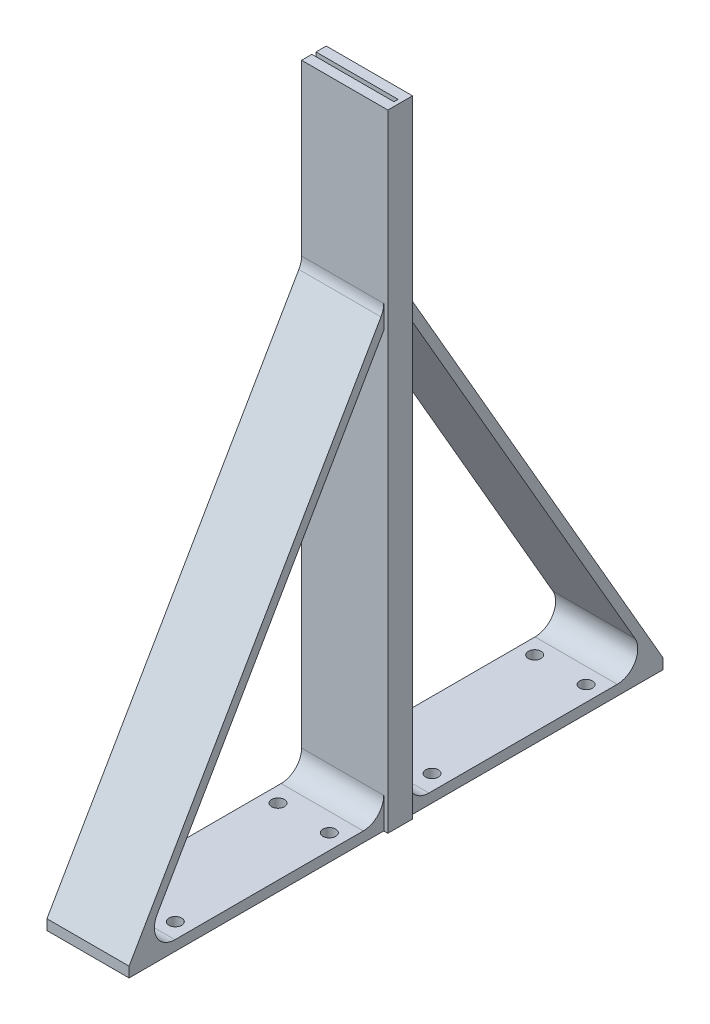
ISO-10303-21;
HEADER;
FILE_DESCRIPTION(('STEP AP214'),'2;1');
FILE_NAME('part.step','',(''),(''),'','','');
FILE_SCHEMA(('AUTOMOTIVE_DESIGN { 1 0 10303 214 1 1 1 1 }'));
ENDSEC;
DATA;
#1=APPLICATION_CONTEXT('core data for automotive mechanical design processes');
#2=APPLICATION_PROTOCOL_DEFINITION('international standard','automotive_design',2000,#1);
#3=PRODUCT_CONTEXT('',#1,'mechanical');
#4=PRODUCT('Part','Part','',(#3));
#5=PRODUCT_RELATED_PRODUCT_CATEGORY('part','',(#4));
#6=PRODUCT_DEFINITION_FORMATION('','',#4);
#7=PRODUCT_DEFINITION_CONTEXT('part definition',#1,'design');
#8=PRODUCT_DEFINITION('design','',#6,#7);
#9=PRODUCT_DEFINITION_SHAPE('','',#8);
#10=(LENGTH_UNIT() NAMED_UNIT(*) SI_UNIT(.MILLI.,.METRE.));
#11=(NAMED_UNIT(*) PLANE_ANGLE_UNIT() SI_UNIT($,.RADIAN.));
#12=(NAMED_UNIT(*) SI_UNIT($,.STERADIAN.) SOLID_ANGLE_UNIT());
#13=UNCERTAINTY_MEASURE_WITH_UNIT(LENGTH_MEASURE(1.E-05),#10,'distance_accuracy_value','');
#14=(GEOMETRIC_REPRESENTATION_CONTEXT(3) GLOBAL_UNCERTAINTY_ASSIGNED_CONTEXT((#13)) GLOBAL_UNIT_ASSIGNED_CONTEXT((#10,
#11,#12)) REPRESENTATION_CONTEXT('',''));
#15=CARTESIAN_POINT('',(0.,0.,0.));
#16=DIRECTION('',(0.,0.,1.));
#17=DIRECTION('',(1.,0.,0.));
#18=AXIS2_PLACEMENT_3D('',#15,#16,#17);
#19=CARTESIAN_POINT('',(20.,5.,130.));
#20=DIRECTION('',(-1.,0.,0.));
#21=DIRECTION('',(0.,0.,1.));
#22=AXIS2_PLACEMENT_3D('',#19,#20,#21);
#23=PLANE('',#22);
#24=DIRECTION('',(0.,-1.,0.));
#25=VECTOR('',#24,1.);
#26=CARTESIAN_POINT('',(20.,305.,6.00000000000001));
#27=LINE('',#26,#25);
#28=CARTESIAN_POINT('',(20.,222.45379206285,5.99999999999999));
#29=VERTEX_POINT('',#28);
#30=CARTESIAN_POINT('',(20.,211.114046100694,5.99999999999999));
#31=VERTEX_POINT('',#30);
#32=EDGE_CURVE('E395',#29,#31,#27,.T.);
#33=ORIENTED_EDGE('',*,*,#32,.F.);
#34=CARTESIAN_POINT('',(20.,222.45379206285,16.));
#35=DIRECTION('',(-1.,0.,0.));
#36=DIRECTION('',(0.,0.,1.));
#37=AXIS2_PLACEMENT_3D('',#34,#35,#36);
#38=CIRCLE('',#37,10.);
#39=CARTESIAN_POINT('',(20.,217.45379206285,7.33974596215564));
#40=VERTEX_POINT('',#39);
#41=EDGE_CURVE('E423',#29,#40,#38,.T.);
#42=ORIENTED_EDGE('',*,*,#41,.T.);
#43=DIRECTION('',(0.,-0.866025403784436,0.500000000000004));
#44=VECTOR('',#43,1.);
#45=CARTESIAN_POINT('',(20.,5.,130.));
#46=LINE('',#45,#44);
#47=CARTESIAN_POINT('',(20.,5.,130.));
#48=VERTEX_POINT('',#47);
#49=EDGE_CURVE('E260',#40,#48,#46,.T.);
#50=ORIENTED_EDGE('',*,*,#49,.T.);
#51=DIRECTION('',(0.,-1.,0.));
#52=VECTOR('',#51,1.);
#53=CARTESIAN_POINT('',(20.,5.,130.));
#54=LINE('',#53,#52);
#55=CARTESIAN_POINT('',(20.,0.,130.));
#56=VERTEX_POINT('',#55);
#57=EDGE_CURVE('E371',#48,#56,#54,.T.);
#58=ORIENTED_EDGE('',*,*,#57,.T.);
#59=DIRECTION('',(0.,0.,-1.));
#60=VECTOR('',#59,1.);
#61=CARTESIAN_POINT('',(20.,0.,130.));
#62=LINE('',#61,#60);
#63=CARTESIAN_POINT('',(20.,0.,5.99999999999997));
#64=VERTEX_POINT('',#63);
#65=EDGE_CURVE('E372',#56,#64,#62,.T.);
#66=ORIENTED_EDGE('',*,*,#65,.T.);
#67=CARTESIAN_POINT('',(20.,15.,5.99999999999997));
#68=VERTEX_POINT('',#67);
#69=EDGE_CURVE('E238',#68,#64,#27,.T.);
#70=ORIENTED_EDGE('',*,*,#69,.F.);
#71=CARTESIAN_POINT('',(20.,15.,16.));
#72=DIRECTION('',(-1.,0.,0.));
#73=DIRECTION('',(0.,0.,1.));
#74=AXIS2_PLACEMENT_3D('',#71,#72,#73);
#75=CIRCLE('',#74,10.);
#76=CARTESIAN_POINT('',(20.,5.,16.));
#77=VERTEX_POINT('',#76);
#78=EDGE_CURVE('E430',#68,#77,#75,.T.);
#79=ORIENTED_EDGE('',*,*,#78,.T.);
#80=DIRECTION('',(0.,0.,-1.));
#81=VECTOR('',#80,1.);
#82=CARTESIAN_POINT('',(20.,5.,130.));
#83=LINE('',#82,#81);
#84=CARTESIAN_POINT('',(20.,5.,107.679491924311));
#85=VERTEX_POINT('',#84);
#86=EDGE_CURVE('E359',#85,#77,#83,.T.);
#87=ORIENTED_EDGE('',*,*,#86,.F.);
#88=CARTESIAN_POINT('',(20.,15.,107.679491924311));
#89=DIRECTION('',(-1.,0.,0.));
#90=DIRECTION('',(0.,0.,1.));
#91=AXIS2_PLACEMENT_3D('',#88,#89,#90);
#92=CIRCLE('',#91,10.);
#93=CARTESIAN_POINT('',(20.,20.,116.339745962156));
#94=VERTEX_POINT('',#93);
#95=EDGE_CURVE('E441',#85,#94,#92,.T.);
#96=ORIENTED_EDGE('',*,*,#95,.T.);
#97=DIRECTION('',(0.,0.866025403784436,-0.500000000000004));
#98=VECTOR('',#97,1.);
#99=CARTESIAN_POINT('',(20.,211.114046100694,6.));
#100=LINE('',#99,#98);
#101=EDGE_CURVE('E262',#94,#31,#100,.T.);
#102=ORIENTED_EDGE('',*,*,#101,.T.);
#103=EDGE_LOOP('',(#33,#42,#50,#58,#66,#70,#79,#87,#96,#102));
#104=FACE_BOUND('',#103,.T.);
#105=ADVANCED_FACE('F39',(#104),#23,.F.);
#106=DIRECTION('',(0.,1.,0.));
#107=VECTOR('',#106,1.);
#108=CARTESIAN_POINT('',(20.,305.,-6.00000000000001));
#109=LINE('',#108,#107);
#110=CARTESIAN_POINT('',(20.,0.,-6.00000000000003));
#111=VERTEX_POINT('',#110);
#112=CARTESIAN_POINT('',(20.,15.,-6.00000000000003));
#113=VERTEX_POINT('',#112);
#114=EDGE_CURVE('E484',#111,#113,#109,.T.);
#115=ORIENTED_EDGE('',*,*,#114,.F.);
#116=CARTESIAN_POINT('',(20.,0.,-130.));
#117=VERTEX_POINT('',#116);
#118=EDGE_CURVE('E351',#111,#117,#62,.T.);
#119=ORIENTED_EDGE('',*,*,#118,.T.);
#120=DIRECTION('',(0.,-1.,0.));
#121=VECTOR('',#120,1.);
#122=CARTESIAN_POINT('',(20.,5.,-130.));
#123=LINE('',#122,#121);
#124=CARTESIAN_POINT('',(20.,5.,-130.));
#125=VERTEX_POINT('',#124);
#126=EDGE_CURVE('E387',#125,#117,#123,.T.);
#127=ORIENTED_EDGE('',*,*,#126,.F.);
#128=DIRECTION('',(0.,0.866025403784436,0.500000000000004));
#129=VECTOR('',#128,1.);
#130=CARTESIAN_POINT('',(20.,5.,-130.));
#131=LINE('',#130,#129);
#132=CARTESIAN_POINT('',(20.,217.45379206285,-7.33974596215563));
#133=VERTEX_POINT('',#132);
#134=EDGE_CURVE('E248',#125,#133,#131,.T.);
#135=ORIENTED_EDGE('',*,*,#134,.T.);
#136=CARTESIAN_POINT('',(20.,222.45379206285,-16.));
#137=DIRECTION('',(-1.,0.,0.));
#138=DIRECTION('',(0.,0.,1.));
#139=AXIS2_PLACEMENT_3D('',#136,#137,#138);
#140=CIRCLE('',#139,10.);
#141=CARTESIAN_POINT('',(20.,222.45379206285,-6.00000000000001));
#142=VERTEX_POINT('',#141);
#143=EDGE_CURVE('E427',#133,#142,#140,.T.);
#144=ORIENTED_EDGE('',*,*,#143,.T.);
#145=CARTESIAN_POINT('',(20.,211.114046100694,-6.00000000000001));
#146=VERTEX_POINT('',#145);
#147=EDGE_CURVE('E390',#146,#142,#109,.T.);
#148=ORIENTED_EDGE('',*,*,#147,.F.);
#149=DIRECTION('',(0.,-0.866025403784436,-0.500000000000004));
#150=VECTOR('',#149,1.);
#151=CARTESIAN_POINT('',(20.,211.114046100694,-6.));
#152=LINE('',#151,#150);
#153=CARTESIAN_POINT('',(20.,20.,-116.339745962156));
#154=VERTEX_POINT('',#153);
#155=EDGE_CURVE('E242',#146,#154,#152,.T.);
#156=ORIENTED_EDGE('',*,*,#155,.T.);
#157=CARTESIAN_POINT('',(20.,15.,-107.679491924311));
#158=DIRECTION('',(-1.,0.,0.));
#159=DIRECTION('',(0.,0.,1.));
#160=AXIS2_PLACEMENT_3D('',#157,#158,#159);
#161=CIRCLE('',#160,10.);
#162=CARTESIAN_POINT('',(20.,5.,-107.679491924311));
#163=VERTEX_POINT('',#162);
#164=EDGE_CURVE('E11',#154,#163,#161,.T.);
#165=ORIENTED_EDGE('',*,*,#164,.T.);
#166=CARTESIAN_POINT('',(20.,5.,-16.));
#167=VERTEX_POINT('',#166);
#168=EDGE_CURVE('E354',#167,#163,#83,.T.);
#169=ORIENTED_EDGE('',*,*,#168,.F.);
#170=CARTESIAN_POINT('',(20.,15.,-16.));
#171=DIRECTION('',(-1.,0.,0.));
#172=DIRECTION('',(0.,0.,1.));
#173=AXIS2_PLACEMENT_3D('',#170,#171,#172);
#174=CIRCLE('',#173,10.);
#175=EDGE_CURVE('E436',#167,#113,#174,.T.);
#176=ORIENTED_EDGE('',*,*,#175,.T.);
#177=EDGE_LOOP('',(#115,#119,#127,#135,#144,#148,#156,#165,#169,#176));
#178=FACE_BOUND('',#177,.T.);
#179=ADVANCED_FACE('F525',(#178),#23,.F.);
#180=CARTESIAN_POINT('',(0.,5.,0.));
#181=DIRECTION('',(0.,-1.,0.));
#182=DIRECTION('',(0.,0.,-1.));
#183=AXIS2_PLACEMENT_3D('',#180,#181,#182);
#184=PLANE('',#183);
#185=CARTESIAN_POINT('',(-12.5,5.,-100.));
#186=DIRECTION('',(0.,1.,0.));
#187=DIRECTION('',(0.,0.,1.));
#188=AXIS2_PLACEMENT_3D('',#185,#186,#187);
#189=CIRCLE('',#188,3.1);
#190=CARTESIAN_POINT('',(-12.5,5.,-96.9));
#191=VERTEX_POINT('',#190);
#192=EDGE_CURVE('E348',#191,#191,#189,.T.);
#193=ORIENTED_EDGE('',*,*,#192,.F.);
#194=EDGE_LOOP('',(#193));
#195=FACE_BOUND('',#194,.T.);
#196=CARTESIAN_POINT('',(12.5,5.,-100.));
#197=DIRECTION('',(0.,1.,0.));
#198=DIRECTION('',(0.,0.,-1.));
#199=AXIS2_PLACEMENT_3D('',#196,#197,#198);
#200=CIRCLE('',#199,3.1);
#201=CARTESIAN_POINT('',(12.5,5.,-103.1));
#202=VERTEX_POINT('',#201);
#203=EDGE_CURVE('E342',#202,#202,#200,.T.);
#204=ORIENTED_EDGE('',*,*,#203,.F.);
#205=EDGE_LOOP('',(#204));
#206=FACE_BOUND('',#205,.T.);
#207=CARTESIAN_POINT('',(-12.5,5.,-25.));
#208=DIRECTION('',(0.,1.,0.));
#209=DIRECTION('',(0.,0.,1.));
#210=AXIS2_PLACEMENT_3D('',#207,#208,#209);
#211=CIRCLE('',#210,3.1);
#212=CARTESIAN_POINT('',(-12.5,5.,-21.9));
#213=VERTEX_POINT('',#212);
#214=EDGE_CURVE('E324',#213,#213,#211,.T.);
#215=ORIENTED_EDGE('',*,*,#214,.F.);
#216=EDGE_LOOP('',(#215));
#217=FACE_BOUND('',#216,.T.);
#218=CARTESIAN_POINT('',(12.5,5.,-25.));
#219=DIRECTION('',(0.,1.,0.));
#220=DIRECTION('',(0.,0.,-1.));
#221=AXIS2_PLACEMENT_3D('',#218,#219,#220);
#222=CIRCLE('',#221,3.1);
#223=CARTESIAN_POINT('',(12.5,5.,-28.1));
#224=VERTEX_POINT('',#223);
#225=EDGE_CURVE('E318',#224,#224,#222,.T.);
#226=ORIENTED_EDGE('',*,*,#225,.F.);
#227=EDGE_LOOP('',(#226));
#228=FACE_BOUND('',#227,.T.);
#229=DIRECTION('',(0.,0.,1.));
#230=VECTOR('',#229,1.);
#231=CARTESIAN_POINT('',(-20.,5.,130.));
#232=LINE('',#231,#230);
#233=CARTESIAN_POINT('',(-20.,5.,-107.679491924311));
#234=VERTEX_POINT('',#233);
#235=CARTESIAN_POINT('',(-20.,5.,-16.));
#236=VERTEX_POINT('',#235);
#237=EDGE_CURVE('E364',#234,#236,#232,.T.);
#238=ORIENTED_EDGE('',*,*,#237,.T.);
#239=DIRECTION('',(-1.,0.,0.));
#240=VECTOR('',#239,1.);
#241=CARTESIAN_POINT('',(20.,5.,-16.));
#242=LINE('',#241,#240);
#243=EDGE_CURVE('E415',#236,#167,#242,.F.);
#244=ORIENTED_EDGE('',*,*,#243,.T.);
#245=ORIENTED_EDGE('',*,*,#168,.T.);
#246=DIRECTION('',(-1.,0.,0.));
#247=VECTOR('',#246,1.);
#248=CARTESIAN_POINT('',(-20.,5.,-107.679491924311));
#249=LINE('',#248,#247);
#250=EDGE_CURVE('E412',#163,#234,#249,.T.);
#251=ORIENTED_EDGE('',*,*,#250,.T.);
#252=EDGE_LOOP('',(#238,#244,#245,#251));
#253=FACE_BOUND('',#252,.T.);
#254=ADVANCED_FACE('F544',(#195,#206,#217,#228,#253),#184,.F.);
#255=CARTESIAN_POINT('',(-20.,305.,-6.));
#256=DIRECTION('',(0.,0.,1.));
#257=DIRECTION('',(1.,0.,0.));
#258=AXIS2_PLACEMENT_3D('',#255,#256,#257);
#259=PLANE('',#258);
#260=ORIENTED_EDGE('',*,*,#147,.T.);
#261=DIRECTION('',(-1.,0.,0.));
#262=VECTOR('',#261,1.);
#263=CARTESIAN_POINT('',(-20.,222.45379206285,-6.));
#264=LINE('',#263,#262);
#265=CARTESIAN_POINT('',(-20.,222.45379206285,-6.));
#266=VERTEX_POINT('',#265);
#267=EDGE_CURVE('E403',#142,#266,#264,.T.);
#268=ORIENTED_EDGE('',*,*,#267,.T.);
#269=DIRECTION('',(0.,-1.,0.));
#270=VECTOR('',#269,1.);
#271=CARTESIAN_POINT('',(-20.,305.,-6.));
#272=LINE('',#271,#270);
#273=CARTESIAN_POINT('',(-20.,305.,-6.));
#274=VERTEX_POINT('',#273);
#275=EDGE_CURVE('E302',#274,#266,#272,.T.);
#276=ORIENTED_EDGE('',*,*,#275,.F.);
#277=DIRECTION('',(-1.,0.,0.));
#278=VECTOR('',#277,1.);
#279=CARTESIAN_POINT('',(-20.,305.,-6.));
#280=LINE('',#279,#278);
#281=CARTESIAN_POINT('',(22.,305.,-6.00000000000001));
#282=VERTEX_POINT('',#281);
#283=EDGE_CURVE('E287',#282,#274,#280,.T.);
#284=ORIENTED_EDGE('',*,*,#283,.F.);
#285=DIRECTION('',(0.,1.,0.));
#286=VECTOR('',#285,1.);
#287=CARTESIAN_POINT('',(22.,305.,-6.00000000000001));
#288=LINE('',#287,#286);
#289=CARTESIAN_POINT('',(22.,0.,-6.00000000000003));
#290=VERTEX_POINT('',#289);
#291=EDGE_CURVE('E224',#290,#282,#288,.T.);
#292=ORIENTED_EDGE('',*,*,#291,.F.);
#293=DIRECTION('',(-1.,0.,0.));
#294=VECTOR('',#293,1.);
#295=CARTESIAN_POINT('',(22.,0.,-6.00000000000003));
#296=LINE('',#295,#294);
#297=EDGE_CURVE('E220',#290,#111,#296,.T.);
#298=ORIENTED_EDGE('',*,*,#297,.T.);
#299=ORIENTED_EDGE('',*,*,#114,.T.);
#300=DIRECTION('',(-1.,0.,0.));
#301=VECTOR('',#300,1.);
#302=CARTESIAN_POINT('',(-20.,15.,-6.));
#303=LINE('',#302,#301);
#304=CARTESIAN_POINT('',(-20.,15.,-6.));
#305=VERTEX_POINT('',#304);
#306=EDGE_CURVE('E400',#113,#305,#303,.T.);
#307=ORIENTED_EDGE('',*,*,#306,.T.);
#308=CARTESIAN_POINT('',(-20.,211.114046100694,-6.));
#309=VERTEX_POINT('',#308);
#310=EDGE_CURVE('E301',#309,#305,#272,.T.);
#311=ORIENTED_EDGE('',*,*,#310,.F.);
#312=DIRECTION('',(-1.,0.,0.));
#313=VECTOR('',#312,1.);
#314=CARTESIAN_POINT('',(20.,211.114046100694,-6.));
#315=LINE('',#314,#313);
#316=EDGE_CURVE('E239',#146,#309,#315,.T.);
#317=ORIENTED_EDGE('',*,*,#316,.F.);
#318=EDGE_LOOP('',(#260,#268,#276,#284,#292,#298,#299,#307,#311,#317));
#319=FACE_BOUND('',#318,.T.);
#320=ADVANCED_FACE('F492',(#319),#259,.F.);
#321=CARTESIAN_POINT('',(-12.5,5.,25.));
#322=DIRECTION('',(0.,1.,0.));
#323=DIRECTION('',(0.,0.,-1.));
#324=AXIS2_PLACEMENT_3D('',#321,#322,#323);
#325=CIRCLE('',#324,3.1);
#326=CARTESIAN_POINT('',(-12.5,5.,21.9));
#327=VERTEX_POINT('',#326);
#328=EDGE_CURVE('E306',#327,#327,#325,.T.);
#329=ORIENTED_EDGE('',*,*,#328,.F.);
#330=EDGE_LOOP('',(#329));
#331=FACE_BOUND('',#330,.T.);
#332=CARTESIAN_POINT('',(12.5,5.,25.));
#333=DIRECTION('',(0.,1.,0.));
#334=DIRECTION('',(0.,0.,1.));
#335=AXIS2_PLACEMENT_3D('',#332,#333,#334);
#336=CIRCLE('',#335,3.1);
#337=CARTESIAN_POINT('',(12.5,5.,28.1));
#338=VERTEX_POINT('',#337);
#339=EDGE_CURVE('E312',#338,#338,#336,.T.);
#340=ORIENTED_EDGE('',*,*,#339,.F.);
#341=EDGE_LOOP('',(#340));
#342=FACE_BOUND('',#341,.T.);
#343=CARTESIAN_POINT('',(-12.5,5.,100.));
#344=DIRECTION('',(0.,1.,0.));
#345=DIRECTION('',(0.,0.,-1.));
#346=AXIS2_PLACEMENT_3D('',#343,#344,#345);
#347=CIRCLE('',#346,3.1);
#348=CARTESIAN_POINT('',(-12.5,5.,96.9));
#349=VERTEX_POINT('',#348);
#350=EDGE_CURVE('E330',#349,#349,#347,.T.);
#351=ORIENTED_EDGE('',*,*,#350,.F.);
#352=EDGE_LOOP('',(#351));
#353=FACE_BOUND('',#352,.T.);
#354=CARTESIAN_POINT('',(12.5,5.,100.));
#355=DIRECTION('',(0.,1.,0.));
#356=DIRECTION('',(0.,0.,1.));
#357=AXIS2_PLACEMENT_3D('',#354,#355,#356);
#358=CIRCLE('',#357,3.1);
#359=CARTESIAN_POINT('',(12.5,5.,103.1));
#360=VERTEX_POINT('',#359);
#361=EDGE_CURVE('E336',#360,#360,#358,.T.);
#362=ORIENTED_EDGE('',*,*,#361,.F.);
#363=EDGE_LOOP('',(#362));
#364=FACE_BOUND('',#363,.T.);
#365=ORIENTED_EDGE('',*,*,#86,.T.);
#366=DIRECTION('',(1.,0.,0.));
#367=VECTOR('',#366,1.);
#368=CARTESIAN_POINT('',(-20.,5.,16.));
#369=LINE('',#368,#367);
#370=CARTESIAN_POINT('',(-20.,5.,16.));
#371=VERTEX_POINT('',#370);
#372=EDGE_CURVE('E410',#77,#371,#369,.F.);
#373=ORIENTED_EDGE('',*,*,#372,.T.);
#374=CARTESIAN_POINT('',(-20.,5.,107.679491924311));
#375=VERTEX_POINT('',#374);
#376=EDGE_CURVE('E363',#371,#375,#232,.T.);
#377=ORIENTED_EDGE('',*,*,#376,.T.);
#378=DIRECTION('',(-1.,0.,0.));
#379=VECTOR('',#378,1.);
#380=CARTESIAN_POINT('',(20.,5.,107.679491924311));
#381=LINE('',#380,#379);
#382=EDGE_CURVE('E408',#375,#85,#381,.F.);
#383=ORIENTED_EDGE('',*,*,#382,.T.);
#384=EDGE_LOOP('',(#365,#373,#377,#383));
#385=FACE_BOUND('',#384,.T.);
#386=ADVANCED_FACE('F464',(#331,#342,#353,#364,#385),#184,.F.);
#387=CARTESIAN_POINT('',(-20.,305.,6.));
#388=DIRECTION('',(0.,0.,-1.));
#389=DIRECTION('',(-1.,0.,0.));
#390=AXIS2_PLACEMENT_3D('',#387,#388,#389);
#391=PLANE('',#390);
#392=DIRECTION('',(0.,-1.,0.));
#393=VECTOR('',#392,1.);
#394=CARTESIAN_POINT('',(-20.,305.,6.));
#395=LINE('',#394,#393);
#396=CARTESIAN_POINT('',(-20.,305.,6.));
#397=VERTEX_POINT('',#396);
#398=CARTESIAN_POINT('',(-20.,222.45379206285,6.));
#399=VERTEX_POINT('',#398);
#400=EDGE_CURVE('E268',#397,#399,#395,.T.);
#401=ORIENTED_EDGE('',*,*,#400,.T.);
#402=DIRECTION('',(-1.,0.,0.));
#403=VECTOR('',#402,1.);
#404=CARTESIAN_POINT('',(20.,222.45379206285,6.00000000000001));
#405=LINE('',#404,#403);
#406=EDGE_CURVE('E397',#399,#29,#405,.F.);
#407=ORIENTED_EDGE('',*,*,#406,.T.);
#408=ORIENTED_EDGE('',*,*,#32,.T.);
#409=DIRECTION('',(-1.,0.,0.));
#410=VECTOR('',#409,1.);
#411=CARTESIAN_POINT('',(20.,211.114046100694,6.));
#412=LINE('',#411,#410);
#413=CARTESIAN_POINT('',(-20.,211.114046100694,6.));
#414=VERTEX_POINT('',#413);
#415=EDGE_CURVE('E264',#31,#414,#412,.T.);
#416=ORIENTED_EDGE('',*,*,#415,.T.);
#417=CARTESIAN_POINT('',(-20.,15.,6.));
#418=VERTEX_POINT('',#417);
#419=EDGE_CURVE('E267',#414,#418,#395,.T.);
#420=ORIENTED_EDGE('',*,*,#419,.T.);
#421=DIRECTION('',(1.,0.,0.));
#422=VECTOR('',#421,1.);
#423=CARTESIAN_POINT('',(20.,15.,6.00000000000001));
#424=LINE('',#423,#422);
#425=EDGE_CURVE('E394',#418,#68,#424,.T.);
#426=ORIENTED_EDGE('',*,*,#425,.T.);
#427=ORIENTED_EDGE('',*,*,#69,.T.);
#428=DIRECTION('',(-1.,0.,0.));
#429=VECTOR('',#428,1.);
#430=CARTESIAN_POINT('',(22.,0.,5.99999999999997));
#431=LINE('',#430,#429);
#432=CARTESIAN_POINT('',(22.,0.,5.99999999999997));
#433=VERTEX_POINT('',#432);
#434=EDGE_CURVE('E217',#433,#64,#431,.T.);
#435=ORIENTED_EDGE('',*,*,#434,.F.);
#436=DIRECTION('',(0.,-1.,0.));
#437=VECTOR('',#436,1.);
#438=CARTESIAN_POINT('',(22.,305.,6.00000000000001));
#439=LINE('',#438,#437);
#440=CARTESIAN_POINT('',(22.,305.,6.00000000000001));
#441=VERTEX_POINT('',#440);
#442=EDGE_CURVE('E225',#441,#433,#439,.T.);
#443=ORIENTED_EDGE('',*,*,#442,.F.);
#444=DIRECTION('',(1.,0.,0.));
#445=VECTOR('',#444,1.);
#446=CARTESIAN_POINT('',(-20.,305.,6.));
#447=LINE('',#446,#445);
#448=EDGE_CURVE('E283',#397,#441,#447,.T.);
#449=ORIENTED_EDGE('',*,*,#448,.F.);
#450=EDGE_LOOP('',(#401,#407,#408,#416,#420,#426,#427,#435,#443,#449));
#451=FACE_BOUND('',#450,.T.);
#452=ADVANCED_FACE('F236',(#451),#391,.F.);
#453=DIRECTION('',(-1.,0.,0.));
#454=VECTOR('',#453,1.);
#455=CARTESIAN_POINT('',(-20.,5.,1.));
#456=LINE('',#455,#454);
#457=CARTESIAN_POINT('',(20.,5.,1.));
#458=VERTEX_POINT('',#457);
#459=CARTESIAN_POINT('',(-20.,5.,1.));
#460=VERTEX_POINT('',#459);
#461=EDGE_CURVE('E277',#458,#460,#456,.T.);
#462=ORIENTED_EDGE('',*,*,#461,.F.);
#463=CARTESIAN_POINT('',(20.,5.,-1.));
#464=VERTEX_POINT('',#463);
#465=EDGE_CURVE('E357',#458,#464,#83,.T.);
#466=ORIENTED_EDGE('',*,*,#465,.T.);
#467=DIRECTION('',(1.,0.,0.));
#468=VECTOR('',#467,1.);
#469=CARTESIAN_POINT('',(-20.,5.,-1.));
#470=LINE('',#469,#468);
#471=CARTESIAN_POINT('',(-20.,5.,-1.));
#472=VERTEX_POINT('',#471);
#473=EDGE_CURVE('E280',#472,#464,#470,.T.);
#474=ORIENTED_EDGE('',*,*,#473,.F.);
#475=EDGE_CURVE('E368',#472,#460,#232,.T.);
#476=ORIENTED_EDGE('',*,*,#475,.T.);
#477=EDGE_LOOP('',(#462,#466,#474,#476));
#478=FACE_BOUND('',#477,.T.);
#479=ADVANCED_FACE('F469',(#478),#184,.F.);
#480=CARTESIAN_POINT('',(0.,0.,0.));
#481=DIRECTION('',(0.,-1.,0.));
#482=DIRECTION('',(0.,0.,-1.));
#483=AXIS2_PLACEMENT_3D('',#480,#481,#482);
#484=PLANE('',#483);
#485=CARTESIAN_POINT('',(12.5,0.,25.));
#486=DIRECTION('',(0.,1.,0.));
#487=DIRECTION('',(0.,0.,1.));
#488=AXIS2_PLACEMENT_3D('',#485,#486,#487);
#489=CIRCLE('',#488,3.1);
#490=CARTESIAN_POINT('',(12.5,0.,28.1));
#491=VERTEX_POINT('',#490);
#492=EDGE_CURVE('E309',#491,#491,#489,.T.);
#493=ORIENTED_EDGE('',*,*,#492,.T.);
#494=EDGE_LOOP('',(#493));
#495=FACE_BOUND('',#494,.T.);
#496=CARTESIAN_POINT('',(-12.5,0.,-25.));
#497=DIRECTION('',(0.,1.,0.));
#498=DIRECTION('',(0.,0.,1.));
#499=AXIS2_PLACEMENT_3D('',#496,#497,#498);
#500=CIRCLE('',#499,3.1);
#501=CARTESIAN_POINT('',(-12.5,0.,-21.9));
#502=VERTEX_POINT('',#501);
#503=EDGE_CURVE('E321',#502,#502,#500,.T.);
#504=ORIENTED_EDGE('',*,*,#503,.T.);
#505=EDGE_LOOP('',(#504));
#506=FACE_BOUND('',#505,.T.);
#507=CARTESIAN_POINT('',(12.5,0.,100.));
#508=DIRECTION('',(0.,1.,0.));
#509=DIRECTION('',(0.,0.,1.));
#510=AXIS2_PLACEMENT_3D('',#507,#508,#509);
#511=CIRCLE('',#510,3.1);
#512=CARTESIAN_POINT('',(12.5,0.,103.1));
#513=VERTEX_POINT('',#512);
#514=EDGE_CURVE('E333',#513,#513,#511,.T.);
#515=ORIENTED_EDGE('',*,*,#514,.T.);
#516=EDGE_LOOP('',(#515));
#517=FACE_BOUND('',#516,.T.);
#518=CARTESIAN_POINT('',(-12.5,0.,-100.));
#519=DIRECTION('',(0.,1.,0.));
#520=DIRECTION('',(0.,0.,1.));
#521=AXIS2_PLACEMENT_3D('',#518,#519,#520);
#522=CIRCLE('',#521,3.1);
#523=CARTESIAN_POINT('',(-12.5,0.,-96.9));
#524=VERTEX_POINT('',#523);
#525=EDGE_CURVE('E345',#524,#524,#522,.T.);
#526=ORIENTED_EDGE('',*,*,#525,.T.);
#527=EDGE_LOOP('',(#526));
#528=FACE_BOUND('',#527,.T.);
#529=ORIENTED_EDGE('',*,*,#65,.F.);
#530=DIRECTION('',(1.,0.,0.));
#531=VECTOR('',#530,1.);
#532=CARTESIAN_POINT('',(-20.,0.,130.));
#533=LINE('',#532,#531);
#534=CARTESIAN_POINT('',(-20.,0.,130.));
#535=VERTEX_POINT('',#534);
#536=EDGE_CURVE('E358',#535,#56,#533,.T.);
#537=ORIENTED_EDGE('',*,*,#536,.F.);
#538=DIRECTION('',(0.,0.,1.));
#539=VECTOR('',#538,1.);
#540=CARTESIAN_POINT('',(-20.,0.,130.));
#541=LINE('',#540,#539);
#542=CARTESIAN_POINT('',(-20.,0.,-130.));
#543=VERTEX_POINT('',#542);
#544=EDGE_CURVE('E376',#543,#535,#541,.T.);
#545=ORIENTED_EDGE('',*,*,#544,.F.);
#546=DIRECTION('',(-1.,0.,0.));
#547=VECTOR('',#546,1.);
#548=CARTESIAN_POINT('',(-20.,0.,-130.));
#549=LINE('',#548,#547);
#550=EDGE_CURVE('E374',#117,#543,#549,.T.);
#551=ORIENTED_EDGE('',*,*,#550,.F.);
#552=ORIENTED_EDGE('',*,*,#118,.F.);
#553=ORIENTED_EDGE('',*,*,#297,.F.);
#554=DIRECTION('',(0.,0.,-1.));
#555=VECTOR('',#554,1.);
#556=CARTESIAN_POINT('',(22.,0.,5.99999999999997));
#557=LINE('',#556,#555);
#558=EDGE_CURVE('E211',#433,#290,#557,.T.);
#559=ORIENTED_EDGE('',*,*,#558,.F.);
#560=ORIENTED_EDGE('',*,*,#434,.T.);
#561=EDGE_LOOP('',(#529,#537,#545,#551,#552,#553,#559,#560));
#562=FACE_BOUND('',#561,.T.);
#563=CARTESIAN_POINT('',(12.5,0.,-100.));
#564=DIRECTION('',(0.,1.,0.));
#565=DIRECTION('',(0.,0.,-1.));
#566=AXIS2_PLACEMENT_3D('',#563,#564,#565);
#567=CIRCLE('',#566,3.1);
#568=CARTESIAN_POINT('',(12.5,0.,-103.1));
#569=VERTEX_POINT('',#568);
#570=EDGE_CURVE('E339',#569,#569,#567,.T.);
#571=ORIENTED_EDGE('',*,*,#570,.T.);
#572=EDGE_LOOP('',(#571));
#573=FACE_BOUND('',#572,.T.);
#574=CARTESIAN_POINT('',(-12.5,0.,100.));
#575=DIRECTION('',(0.,1.,0.));
#576=DIRECTION('',(0.,0.,-1.));
#577=AXIS2_PLACEMENT_3D('',#574,#575,#576);
#578=CIRCLE('',#577,3.1);
#579=CARTESIAN_POINT('',(-12.5,0.,96.9));
#580=VERTEX_POINT('',#579);
#581=EDGE_CURVE('E327',#580,#580,#578,.T.);
#582=ORIENTED_EDGE('',*,*,#581,.T.);
#583=EDGE_LOOP('',(#582));
#584=FACE_BOUND('',#583,.T.);
#585=CARTESIAN_POINT('',(12.5,0.,-25.));
#586=DIRECTION('',(0.,1.,0.));
#587=DIRECTION('',(0.,0.,-1.));
#588=AXIS2_PLACEMENT_3D('',#585,#586,#587);
#589=CIRCLE('',#588,3.1);
#590=CARTESIAN_POINT('',(12.5,0.,-28.1));
#591=VERTEX_POINT('',#590);
#592=EDGE_CURVE('E315',#591,#591,#589,.T.);
#593=ORIENTED_EDGE('',*,*,#592,.T.);
#594=EDGE_LOOP('',(#593));
#595=FACE_BOUND('',#594,.T.);
#596=CARTESIAN_POINT('',(-12.5,0.,25.));
#597=DIRECTION('',(0.,1.,0.));
#598=DIRECTION('',(0.,0.,-1.));
#599=AXIS2_PLACEMENT_3D('',#596,#597,#598);
#600=CIRCLE('',#599,3.1);
#601=CARTESIAN_POINT('',(-12.5,0.,21.9));
#602=VERTEX_POINT('',#601);
#603=EDGE_CURVE('E305',#602,#602,#600,.T.);
#604=ORIENTED_EDGE('',*,*,#603,.T.);
#605=EDGE_LOOP('',(#604));
#606=FACE_BOUND('',#605,.T.);
#607=ADVANCED_FACE('F214',(#495,#506,#517,#528,#562,#573,#584,#595,#606),#484,.T.);
#608=CARTESIAN_POINT('',(-20.,5.,-130.));
#609=DIRECTION('',(0.,0.,1.));
#610=DIRECTION('',(1.,0.,0.));
#611=AXIS2_PLACEMENT_3D('',#608,#609,#610);
#612=PLANE('',#611);
#613=ORIENTED_EDGE('',*,*,#550,.T.);
#614=DIRECTION('',(0.,-1.,0.));
#615=VECTOR('',#614,1.);
#616=CARTESIAN_POINT('',(-20.,5.,-130.));
#617=LINE('',#616,#615);
#618=CARTESIAN_POINT('',(-20.,5.,-130.));
#619=VERTEX_POINT('',#618);
#620=EDGE_CURVE('E384',#619,#543,#617,.T.);
#621=ORIENTED_EDGE('',*,*,#620,.F.);
#622=DIRECTION('',(-1.,0.,0.));
#623=VECTOR('',#622,1.);
#624=CARTESIAN_POINT('',(-20.,5.,-130.));
#625=LINE('',#624,#623);
#626=EDGE_CURVE('E360',#125,#619,#625,.T.);
#627=ORIENTED_EDGE('',*,*,#626,.F.);
#628=ORIENTED_EDGE('',*,*,#126,.T.);
#629=EDGE_LOOP('',(#613,#621,#627,#628));
#630=FACE_BOUND('',#629,.T.);
#631=ADVANCED_FACE('F521',(#630),#612,.F.);
#632=CARTESIAN_POINT('',(-20.,5.,130.));
#633=DIRECTION('',(1.,0.,0.));
#634=DIRECTION('',(0.,0.,-1.));
#635=AXIS2_PLACEMENT_3D('',#632,#633,#634);
#636=PLANE('',#635);
#637=ORIENTED_EDGE('',*,*,#237,.F.);
#638=CARTESIAN_POINT('',(-20.,15.,-107.679491924311));
#639=DIRECTION('',(1.,0.,0.));
#640=DIRECTION('',(0.,0.,-1.));
#641=AXIS2_PLACEMENT_3D('',#638,#639,#640);
#642=CIRCLE('',#641,10.);
#643=CARTESIAN_POINT('',(-20.,20.,-116.339745962156));
#644=VERTEX_POINT('',#643);
#645=EDGE_CURVE('E47',#234,#644,#642,.T.);
#646=ORIENTED_EDGE('',*,*,#645,.T.);
#647=DIRECTION('',(0.,-0.866025403784436,-0.500000000000004));
#648=VECTOR('',#647,1.);
#649=CARTESIAN_POINT('',(-20.,211.114046100694,-6.));
#650=LINE('',#649,#648);
#651=EDGE_CURVE('E251',#309,#644,#650,.T.);
#652=ORIENTED_EDGE('',*,*,#651,.F.);
#653=ORIENTED_EDGE('',*,*,#310,.T.);
#654=CARTESIAN_POINT('',(-20.,15.,-16.));
#655=DIRECTION('',(1.,0.,0.));
#656=DIRECTION('',(0.,0.,-1.));
#657=AXIS2_PLACEMENT_3D('',#654,#655,#656);
#658=CIRCLE('',#657,10.);
#659=EDGE_CURVE('E434',#305,#236,#658,.T.);
#660=ORIENTED_EDGE('',*,*,#659,.T.);
#661=EDGE_LOOP('',(#637,#646,#652,#653,#660));
#662=FACE_BOUND('',#661,.T.);
#663=DIRECTION('',(0.,0.866025403784436,-0.500000000000004));
#664=VECTOR('',#663,1.);
#665=CARTESIAN_POINT('',(-20.,211.114046100694,6.));
#666=LINE('',#665,#664);
#667=CARTESIAN_POINT('',(-20.,20.,116.339745962156));
#668=VERTEX_POINT('',#667);
#669=EDGE_CURVE('E258',#668,#414,#666,.T.);
#670=ORIENTED_EDGE('',*,*,#669,.F.);
#671=CARTESIAN_POINT('',(-20.,15.,107.679491924311));
#672=DIRECTION('',(1.,0.,0.));
#673=DIRECTION('',(0.,0.,-1.));
#674=AXIS2_PLACEMENT_3D('',#671,#672,#673);
#675=CIRCLE('',#674,10.);
#676=EDGE_CURVE('E439',#668,#375,#675,.T.);
#677=ORIENTED_EDGE('',*,*,#676,.T.);
#678=ORIENTED_EDGE('',*,*,#376,.F.);
#679=CARTESIAN_POINT('',(-20.,15.,16.));
#680=DIRECTION('',(1.,0.,0.));
#681=DIRECTION('',(0.,0.,-1.));
#682=AXIS2_PLACEMENT_3D('',#679,#680,#681);
#683=CIRCLE('',#682,10.);
#684=EDGE_CURVE('E432',#371,#418,#683,.T.);
#685=ORIENTED_EDGE('',*,*,#684,.T.);
#686=ORIENTED_EDGE('',*,*,#419,.F.);
#687=EDGE_LOOP('',(#670,#677,#678,#685,#686));
#688=FACE_BOUND('',#687,.T.);
#689=ORIENTED_EDGE('',*,*,#544,.T.);
#690=DIRECTION('',(0.,-1.,0.));
#691=VECTOR('',#690,1.);
#692=CARTESIAN_POINT('',(-20.,5.,130.));
#693=LINE('',#692,#691);
#694=CARTESIAN_POINT('',(-20.,5.,130.));
#695=VERTEX_POINT('',#694);
#696=EDGE_CURVE('E381',#695,#535,#693,.T.);
#697=ORIENTED_EDGE('',*,*,#696,.F.);
#698=DIRECTION('',(0.,-0.866025403784436,0.500000000000004));
#699=VECTOR('',#698,1.);
#700=CARTESIAN_POINT('',(-20.,5.,130.));
#701=LINE('',#700,#699);
#702=CARTESIAN_POINT('',(-20.,217.45379206285,7.33974596215564));
#703=VERTEX_POINT('',#702);
#704=EDGE_CURVE('E256',#703,#695,#701,.T.);
#705=ORIENTED_EDGE('',*,*,#704,.F.);
#706=CARTESIAN_POINT('',(-20.,222.45379206285,16.));
#707=DIRECTION('',(1.,0.,0.));
#708=DIRECTION('',(0.,0.,-1.));
#709=AXIS2_PLACEMENT_3D('',#706,#707,#708);
#710=CIRCLE('',#709,10.);
#711=EDGE_CURVE('E421',#703,#399,#710,.T.);
#712=ORIENTED_EDGE('',*,*,#711,.T.);
#713=ORIENTED_EDGE('',*,*,#400,.F.);
#714=DIRECTION('',(0.,0.,1.));
#715=VECTOR('',#714,1.);
#716=CARTESIAN_POINT('',(-20.,305.,1.));
#717=LINE('',#716,#715);
#718=CARTESIAN_POINT('',(-20.,305.,1.));
#719=VERTEX_POINT('',#718);
#720=EDGE_CURVE('E281',#719,#397,#717,.T.);
#721=ORIENTED_EDGE('',*,*,#720,.F.);
#722=DIRECTION('',(0.,-1.,0.));
#723=VECTOR('',#722,1.);
#724=CARTESIAN_POINT('',(-20.,305.,1.));
#725=LINE('',#724,#723);
#726=EDGE_CURVE('E273',#719,#460,#725,.T.);
#727=ORIENTED_EDGE('',*,*,#726,.T.);
#728=ORIENTED_EDGE('',*,*,#475,.F.);
#729=DIRECTION('',(0.,-1.,0.));
#730=VECTOR('',#729,1.);
#731=CARTESIAN_POINT('',(-20.,305.,-1.));
#732=LINE('',#731,#730);
#733=CARTESIAN_POINT('',(-20.,305.,-1.));
#734=VERTEX_POINT('',#733);
#735=EDGE_CURVE('E298',#734,#472,#732,.T.);
#736=ORIENTED_EDGE('',*,*,#735,.F.);
#737=DIRECTION('',(0.,0.,1.));
#738=VECTOR('',#737,1.);
#739=CARTESIAN_POINT('',(-20.,305.,-1.));
#740=LINE('',#739,#738);
#741=EDGE_CURVE('E289',#274,#734,#740,.T.);
#742=ORIENTED_EDGE('',*,*,#741,.F.);
#743=ORIENTED_EDGE('',*,*,#275,.T.);
#744=CARTESIAN_POINT('',(-20.,222.45379206285,-16.));
#745=DIRECTION('',(1.,0.,0.));
#746=DIRECTION('',(0.,0.,-1.));
#747=AXIS2_PLACEMENT_3D('',#744,#745,#746);
#748=CIRCLE('',#747,10.);
#749=CARTESIAN_POINT('',(-20.,217.45379206285,-7.3397459621556));
#750=VERTEX_POINT('',#749);
#751=EDGE_CURVE('E425',#266,#750,#748,.T.);
#752=ORIENTED_EDGE('',*,*,#751,.T.);
#753=DIRECTION('',(0.,0.866025403784436,0.500000000000004));
#754=VECTOR('',#753,1.);
#755=CARTESIAN_POINT('',(-20.,5.,-130.));
#756=LINE('',#755,#754);
#757=EDGE_CURVE('E253',#619,#750,#756,.T.);
#758=ORIENTED_EDGE('',*,*,#757,.F.);
#759=ORIENTED_EDGE('',*,*,#620,.T.);
#760=EDGE_LOOP('',(#689,#697,#705,#712,#713,#721,#727,#728,#736,#742,#743,#752,#758,#759));
#761=FACE_BOUND('',#760,.T.);
#762=ADVANCED_FACE('F459',(#662,#688,#761),#636,.F.);
#763=CARTESIAN_POINT('',(-20.,5.,130.));
#764=DIRECTION('',(0.,0.,-1.));
#765=DIRECTION('',(-1.,0.,0.));
#766=AXIS2_PLACEMENT_3D('',#763,#764,#765);
#767=PLANE('',#766);
#768=ORIENTED_EDGE('',*,*,#536,.T.);
#769=ORIENTED_EDGE('',*,*,#57,.F.);
#770=DIRECTION('',(1.,0.,0.));
#771=VECTOR('',#770,1.);
#772=CARTESIAN_POINT('',(-20.,5.,130.));
#773=LINE('',#772,#771);
#774=EDGE_CURVE('E367',#695,#48,#773,.T.);
#775=ORIENTED_EDGE('',*,*,#774,.F.);
#776=ORIENTED_EDGE('',*,*,#696,.T.);
#777=EDGE_LOOP('',(#768,#769,#775,#776));
#778=FACE_BOUND('',#777,.T.);
#779=ADVANCED_FACE('F517',(#778),#767,.F.);
#780=CARTESIAN_POINT('',(-12.5,5.,-100.));
#781=DIRECTION('',(0.,-1.,0.));
#782=DIRECTION('',(0.,0.,-1.));
#783=AXIS2_PLACEMENT_3D('',#780,#781,#782);
#784=CYLINDRICAL_SURFACE('',#783,3.1);
#785=ORIENTED_EDGE('',*,*,#192,.T.);
#786=EDGE_LOOP('',(#785));
#787=FACE_BOUND('',#786,.T.);
#788=ORIENTED_EDGE('',*,*,#525,.F.);
#789=EDGE_LOOP('',(#788));
#790=FACE_BOUND('',#789,.T.);
#791=ADVANCED_FACE('F820',(#787,#790),#784,.F.);
#792=CARTESIAN_POINT('',(12.5,5.,-100.));
#793=DIRECTION('',(0.,-1.,0.));
#794=DIRECTION('',(0.,0.,-1.));
#795=AXIS2_PLACEMENT_3D('',#792,#793,#794);
#796=CYLINDRICAL_SURFACE('',#795,3.1);
#797=ORIENTED_EDGE('',*,*,#203,.T.);
#798=EDGE_LOOP('',(#797));
#799=FACE_BOUND('',#798,.T.);
#800=ORIENTED_EDGE('',*,*,#570,.F.);
#801=EDGE_LOOP('',(#800));
#802=FACE_BOUND('',#801,.T.);
#803=ADVANCED_FACE('F810',(#799,#802),#796,.F.);
#804=CARTESIAN_POINT('',(12.5,5.,100.));
#805=DIRECTION('',(0.,-1.,0.));
#806=DIRECTION('',(0.,0.,-1.));
#807=AXIS2_PLACEMENT_3D('',#804,#805,#806);
#808=CYLINDRICAL_SURFACE('',#807,3.1);
#809=ORIENTED_EDGE('',*,*,#361,.T.);
#810=EDGE_LOOP('',(#809));
#811=FACE_BOUND('',#810,.T.);
#812=ORIENTED_EDGE('',*,*,#514,.F.);
#813=EDGE_LOOP('',(#812));
#814=FACE_BOUND('',#813,.T.);
#815=ADVANCED_FACE('F800',(#811,#814),#808,.F.);
#816=CARTESIAN_POINT('',(-12.5,5.,100.));
#817=DIRECTION('',(0.,-1.,0.));
#818=DIRECTION('',(0.,0.,-1.));
#819=AXIS2_PLACEMENT_3D('',#816,#817,#818);
#820=CYLINDRICAL_SURFACE('',#819,3.1);
#821=ORIENTED_EDGE('',*,*,#350,.T.);
#822=EDGE_LOOP('',(#821));
#823=FACE_BOUND('',#822,.T.);
#824=ORIENTED_EDGE('',*,*,#581,.F.);
#825=EDGE_LOOP('',(#824));
#826=FACE_BOUND('',#825,.T.);
#827=ADVANCED_FACE('F790',(#823,#826),#820,.F.);
#828=CARTESIAN_POINT('',(-12.5,5.,-25.));
#829=DIRECTION('',(0.,-1.,0.));
#830=DIRECTION('',(0.,0.,-1.));
#831=AXIS2_PLACEMENT_3D('',#828,#829,#830);
#832=CYLINDRICAL_SURFACE('',#831,3.1);
#833=ORIENTED_EDGE('',*,*,#214,.T.);
#834=EDGE_LOOP('',(#833));
#835=FACE_BOUND('',#834,.T.);
#836=ORIENTED_EDGE('',*,*,#503,.F.);
#837=EDGE_LOOP('',(#836));
#838=FACE_BOUND('',#837,.T.);
#839=ADVANCED_FACE('F780',(#835,#838),#832,.F.);
#840=CARTESIAN_POINT('',(12.5,5.,-25.));
#841=DIRECTION('',(0.,-1.,0.));
#842=DIRECTION('',(0.,0.,-1.));
#843=AXIS2_PLACEMENT_3D('',#840,#841,#842);
#844=CYLINDRICAL_SURFACE('',#843,3.1);
#845=ORIENTED_EDGE('',*,*,#225,.T.);
#846=EDGE_LOOP('',(#845));
#847=FACE_BOUND('',#846,.T.);
#848=ORIENTED_EDGE('',*,*,#592,.F.);
#849=EDGE_LOOP('',(#848));
#850=FACE_BOUND('',#849,.T.);
#851=ADVANCED_FACE('F770',(#847,#850),#844,.F.);
#852=CARTESIAN_POINT('',(12.5,5.,25.));
#853=DIRECTION('',(0.,-1.,0.));
#854=DIRECTION('',(0.,0.,-1.));
#855=AXIS2_PLACEMENT_3D('',#852,#853,#854);
#856=CYLINDRICAL_SURFACE('',#855,3.1);
#857=ORIENTED_EDGE('',*,*,#339,.T.);
#858=EDGE_LOOP('',(#857));
#859=FACE_BOUND('',#858,.T.);
#860=ORIENTED_EDGE('',*,*,#492,.F.);
#861=EDGE_LOOP('',(#860));
#862=FACE_BOUND('',#861,.T.);
#863=ADVANCED_FACE('F760',(#859,#862),#856,.F.);
#864=CARTESIAN_POINT('',(-12.5,5.,25.));
#865=DIRECTION('',(0.,-1.,0.));
#866=DIRECTION('',(0.,0.,-1.));
#867=AXIS2_PLACEMENT_3D('',#864,#865,#866);
#868=CYLINDRICAL_SURFACE('',#867,3.1);
#869=ORIENTED_EDGE('',*,*,#328,.T.);
#870=EDGE_LOOP('',(#869));
#871=FACE_BOUND('',#870,.T.);
#872=ORIENTED_EDGE('',*,*,#603,.F.);
#873=EDGE_LOOP('',(#872));
#874=FACE_BOUND('',#873,.T.);
#875=ADVANCED_FACE('F742',(#871,#874),#868,.F.);
#876=CARTESIAN_POINT('',(-20.,305.,-1.));
#877=DIRECTION('',(0.,0.,-1.));
#878=DIRECTION('',(-1.,0.,0.));
#879=AXIS2_PLACEMENT_3D('',#876,#877,#878);
#880=PLANE('',#879);
#881=ORIENTED_EDGE('',*,*,#473,.T.);
#882=DIRECTION('',(0.,-1.,0.));
#883=VECTOR('',#882,1.);
#884=CARTESIAN_POINT('',(20.,305.,-1.));
#885=LINE('',#884,#883);
#886=CARTESIAN_POINT('',(20.,305.,-1.));
#887=VERTEX_POINT('',#886);
#888=EDGE_CURVE('E294',#887,#464,#885,.T.);
#889=ORIENTED_EDGE('',*,*,#888,.F.);
#890=DIRECTION('',(1.,0.,0.));
#891=VECTOR('',#890,1.);
#892=CARTESIAN_POINT('',(-20.,305.,-1.));
#893=LINE('',#892,#891);
#894=EDGE_CURVE('E291',#734,#887,#893,.T.);
#895=ORIENTED_EDGE('',*,*,#894,.F.);
#896=ORIENTED_EDGE('',*,*,#735,.T.);
#897=EDGE_LOOP('',(#881,#889,#895,#896));
#898=FACE_BOUND('',#897,.T.);
#899=ADVANCED_FACE('F495',(#898),#880,.F.);
#900=CARTESIAN_POINT('',(0.,305.,0.));
#901=DIRECTION('',(0.,-1.,0.));
#902=DIRECTION('',(0.,0.,-1.));
#903=AXIS2_PLACEMENT_3D('',#900,#901,#902);
#904=PLANE('',#903);
#905=ORIENTED_EDGE('',*,*,#894,.T.);
#906=DIRECTION('',(0.,0.,1.));
#907=VECTOR('',#906,1.);
#908=CARTESIAN_POINT('',(20.,305.,6.00000000000001));
#909=LINE('',#908,#907);
#910=CARTESIAN_POINT('',(20.,305.,1.));
#911=VERTEX_POINT('',#910);
#912=EDGE_CURVE('E233',#887,#911,#909,.T.);
#913=ORIENTED_EDGE('',*,*,#912,.T.);
#914=DIRECTION('',(-1.,0.,0.));
#915=VECTOR('',#914,1.);
#916=CARTESIAN_POINT('',(-20.,305.,1.));
#917=LINE('',#916,#915);
#918=EDGE_CURVE('E276',#911,#719,#917,.T.);
#919=ORIENTED_EDGE('',*,*,#918,.T.);
#920=ORIENTED_EDGE('',*,*,#720,.T.);
#921=ORIENTED_EDGE('',*,*,#448,.T.);
#922=DIRECTION('',(0.,0.,1.));
#923=VECTOR('',#922,1.);
#924=CARTESIAN_POINT('',(22.,305.,6.00000000000001));
#925=LINE('',#924,#923);
#926=EDGE_CURVE('E231',#282,#441,#925,.T.);
#927=ORIENTED_EDGE('',*,*,#926,.F.);
#928=ORIENTED_EDGE('',*,*,#283,.T.);
#929=ORIENTED_EDGE('',*,*,#741,.T.);
#930=EDGE_LOOP('',(#905,#913,#919,#920,#921,#927,#928,#929));
#931=FACE_BOUND('',#930,.T.);
#932=ADVANCED_FACE('F479',(#931),#904,.F.);
#933=CARTESIAN_POINT('',(-20.,305.,1.));
#934=DIRECTION('',(0.,0.,1.));
#935=DIRECTION('',(1.,0.,0.));
#936=AXIS2_PLACEMENT_3D('',#933,#934,#935);
#937=PLANE('',#936);
#938=ORIENTED_EDGE('',*,*,#461,.T.);
#939=ORIENTED_EDGE('',*,*,#726,.F.);
#940=ORIENTED_EDGE('',*,*,#918,.F.);
#941=DIRECTION('',(0.,-1.,0.));
#942=VECTOR('',#941,1.);
#943=CARTESIAN_POINT('',(20.,305.,1.));
#944=LINE('',#943,#942);
#945=EDGE_CURVE('E270',#911,#458,#944,.T.);
#946=ORIENTED_EDGE('',*,*,#945,.T.);
#947=EDGE_LOOP('',(#938,#939,#940,#946));
#948=FACE_BOUND('',#947,.T.);
#949=ADVANCED_FACE('F474',(#948),#937,.F.);
#950=CARTESIAN_POINT('',(20.,5.,130.));
#951=DIRECTION('',(0.,-0.500000000000004,-0.866025403784436));
#952=DIRECTION('',(0.,0.866025403784436,-0.500000000000004));
#953=AXIS2_PLACEMENT_3D('',#950,#951,#952);
#954=PLANE('',#953);
#955=ORIENTED_EDGE('',*,*,#49,.F.);
#956=DIRECTION('',(-1.,0.,0.));
#957=VECTOR('',#956,1.);
#958=CARTESIAN_POINT('',(-20.,217.45379206285,7.33974596215565));
#959=LINE('',#958,#957);
#960=EDGE_CURVE('E391',#40,#703,#959,.T.);
#961=ORIENTED_EDGE('',*,*,#960,.T.);
#962=ORIENTED_EDGE('',*,*,#704,.T.);
#963=ORIENTED_EDGE('',*,*,#774,.T.);
#964=EDGE_LOOP('',(#955,#961,#962,#963));
#965=FACE_BOUND('',#964,.T.);
#966=ADVANCED_FACE('F509',(#965),#954,.F.);
#967=CARTESIAN_POINT('',(20.,211.114046100694,6.));
#968=DIRECTION('',(0.,0.500000000000004,0.866025403784436));
#969=DIRECTION('',(0.,-0.866025403784436,0.500000000000004));
#970=AXIS2_PLACEMENT_3D('',#967,#968,#969);
#971=PLANE('',#970);
#972=ORIENTED_EDGE('',*,*,#101,.F.);
#973=DIRECTION('',(-1.,0.,0.));
#974=VECTOR('',#973,1.);
#975=CARTESIAN_POINT('',(-20.,20.,116.339745962156));
#976=LINE('',#975,#974);
#977=EDGE_CURVE('E417',#94,#668,#976,.T.);
#978=ORIENTED_EDGE('',*,*,#977,.T.);
#979=ORIENTED_EDGE('',*,*,#669,.T.);
#980=ORIENTED_EDGE('',*,*,#415,.F.);
#981=EDGE_LOOP('',(#972,#978,#979,#980));
#982=FACE_BOUND('',#981,.T.);
#983=ADVANCED_FACE('F453',(#982),#971,.F.);
#984=CARTESIAN_POINT('',(20.,5.,-130.));
#985=DIRECTION('',(0.,-0.500000000000004,0.866025403784436));
#986=DIRECTION('',(0.,-0.866025403784436,-0.500000000000004));
#987=AXIS2_PLACEMENT_3D('',#984,#985,#986);
#988=PLANE('',#987);
#989=ORIENTED_EDGE('',*,*,#757,.T.);
#990=DIRECTION('',(-1.,0.,0.));
#991=VECTOR('',#990,1.);
#992=CARTESIAN_POINT('',(20.,217.45379206285,-7.33974596215562));
#993=LINE('',#992,#991);
#994=EDGE_CURVE('E406',#750,#133,#993,.F.);
#995=ORIENTED_EDGE('',*,*,#994,.T.);
#996=ORIENTED_EDGE('',*,*,#134,.F.);
#997=ORIENTED_EDGE('',*,*,#626,.T.);
#998=EDGE_LOOP('',(#989,#995,#996,#997));
#999=FACE_BOUND('',#998,.T.);
#1000=ADVANCED_FACE('F528',(#999),#988,.F.);
#1001=CARTESIAN_POINT('',(20.,211.114046100694,-6.));
#1002=DIRECTION('',(0.,0.500000000000004,-0.866025403784436));
#1003=DIRECTION('',(0.,0.866025403784436,0.500000000000004));
#1004=AXIS2_PLACEMENT_3D('',#1001,#1002,#1003);
#1005=PLANE('',#1004);
#1006=ORIENTED_EDGE('',*,*,#651,.T.);
#1007=DIRECTION('',(-1.,0.,0.));
#1008=VECTOR('',#1007,1.);
#1009=CARTESIAN_POINT('',(20.,20.,-116.339745962156));
#1010=LINE('',#1009,#1008);
#1011=EDGE_CURVE('E54',#644,#154,#1010,.F.);
#1012=ORIENTED_EDGE('',*,*,#1011,.T.);
#1013=ORIENTED_EDGE('',*,*,#155,.F.);
#1014=ORIENTED_EDGE('',*,*,#316,.T.);
#1015=EDGE_LOOP('',(#1006,#1012,#1013,#1014));
#1016=FACE_BOUND('',#1015,.T.);
#1017=ADVANCED_FACE('F535',(#1016),#1005,.F.);
#1018=CARTESIAN_POINT('',(20.,0.,0.));
#1019=DIRECTION('',(1.,0.,0.));
#1020=DIRECTION('',(0.,0.,-1.));
#1021=AXIS2_PLACEMENT_3D('',#1018,#1019,#1020);
#1022=PLANE('',#1021);
#1023=ORIENTED_EDGE('',*,*,#912,.F.);
#1024=ORIENTED_EDGE('',*,*,#888,.T.);
#1025=ORIENTED_EDGE('',*,*,#465,.F.);
#1026=ORIENTED_EDGE('',*,*,#945,.F.);
#1027=EDGE_LOOP('',(#1023,#1024,#1025,#1026));
#1028=FACE_BOUND('',#1027,.T.);
#1029=ADVANCED_FACE('F496',(#1028),#1022,.F.);
#1030=CARTESIAN_POINT('',(22.,0.,0.));
#1031=DIRECTION('',(1.,0.,0.));
#1032=DIRECTION('',(0.,0.,-1.));
#1033=AXIS2_PLACEMENT_3D('',#1030,#1031,#1032);
#1034=PLANE('',#1033);
#1035=ORIENTED_EDGE('',*,*,#442,.T.);
#1036=ORIENTED_EDGE('',*,*,#558,.T.);
#1037=ORIENTED_EDGE('',*,*,#291,.T.);
#1038=ORIENTED_EDGE('',*,*,#926,.T.);
#1039=EDGE_LOOP('',(#1035,#1036,#1037,#1038));
#1040=FACE_BOUND('',#1039,.T.);
#1041=ADVANCED_FACE('F229',(#1040),#1034,.T.);
#1042=CARTESIAN_POINT('',(20.0000000000001,222.45379206285,16.));
#1043=DIRECTION('',(1.,0.,0.));
#1044=DIRECTION('',(0.,1.,0.));
#1045=AXIS2_PLACEMENT_3D('',#1042,#1043,#1044);
#1046=CYLINDRICAL_SURFACE('',#1045,10.);
#1047=ORIENTED_EDGE('',*,*,#41,.F.);
#1048=ORIENTED_EDGE('',*,*,#406,.F.);
#1049=ORIENTED_EDGE('',*,*,#711,.F.);
#1050=ORIENTED_EDGE('',*,*,#960,.F.);
#1051=EDGE_LOOP('',(#1047,#1048,#1049,#1050));
#1052=FACE_BOUND('',#1051,.T.);
#1053=ADVANCED_FACE('F512',(#1052),#1046,.F.);
#1054=CARTESIAN_POINT('',(-20.,222.45379206285,-16.));
#1055=DIRECTION('',(1.,0.,0.));
#1056=DIRECTION('',(0.,1.,0.));
#1057=AXIS2_PLACEMENT_3D('',#1054,#1055,#1056);
#1058=CYLINDRICAL_SURFACE('',#1057,10.);
#1059=ORIENTED_EDGE('',*,*,#143,.F.);
#1060=ORIENTED_EDGE('',*,*,#994,.F.);
#1061=ORIENTED_EDGE('',*,*,#751,.F.);
#1062=ORIENTED_EDGE('',*,*,#267,.F.);
#1063=EDGE_LOOP('',(#1059,#1060,#1061,#1062));
#1064=FACE_BOUND('',#1063,.T.);
#1065=ADVANCED_FACE('F532',(#1064),#1058,.F.);
#1066=CARTESIAN_POINT('',(-20.,15.,16.));
#1067=DIRECTION('',(-1.,0.,0.));
#1068=DIRECTION('',(0.,0.,1.));
#1069=AXIS2_PLACEMENT_3D('',#1066,#1067,#1068);
#1070=CYLINDRICAL_SURFACE('',#1069,10.);
#1071=ORIENTED_EDGE('',*,*,#684,.F.);
#1072=ORIENTED_EDGE('',*,*,#372,.F.);
#1073=ORIENTED_EDGE('',*,*,#78,.F.);
#1074=ORIENTED_EDGE('',*,*,#425,.F.);
#1075=EDGE_LOOP('',(#1071,#1072,#1073,#1074));
#1076=FACE_BOUND('',#1075,.T.);
#1077=ADVANCED_FACE('F499',(#1076),#1070,.F.);
#1078=CARTESIAN_POINT('',(-20.,15.,-16.));
#1079=DIRECTION('',(1.,0.,0.));
#1080=DIRECTION('',(0.,0.,-1.));
#1081=AXIS2_PLACEMENT_3D('',#1078,#1079,#1080);
#1082=CYLINDRICAL_SURFACE('',#1081,10.);
#1083=ORIENTED_EDGE('',*,*,#175,.F.);
#1084=ORIENTED_EDGE('',*,*,#243,.F.);
#1085=ORIENTED_EDGE('',*,*,#659,.F.);
#1086=ORIENTED_EDGE('',*,*,#306,.F.);
#1087=EDGE_LOOP('',(#1083,#1084,#1085,#1086));
#1088=FACE_BOUND('',#1087,.T.);
#1089=ADVANCED_FACE('F547',(#1088),#1082,.F.);
#1090=CARTESIAN_POINT('',(20.,15.,107.679491924311));
#1091=DIRECTION('',(1.,0.,0.));
#1092=DIRECTION('',(0.,0.,-1.));
#1093=AXIS2_PLACEMENT_3D('',#1090,#1091,#1092);
#1094=CYLINDRICAL_SURFACE('',#1093,10.);
#1095=ORIENTED_EDGE('',*,*,#95,.F.);
#1096=ORIENTED_EDGE('',*,*,#382,.F.);
#1097=ORIENTED_EDGE('',*,*,#676,.F.);
#1098=ORIENTED_EDGE('',*,*,#977,.F.);
#1099=EDGE_LOOP('',(#1095,#1096,#1097,#1098));
#1100=FACE_BOUND('',#1099,.T.);
#1101=ADVANCED_FACE('F455',(#1100),#1094,.F.);
#1102=CARTESIAN_POINT('',(0.,15.,-107.679491924311));
#1103=DIRECTION('',(1.,0.,0.));
#1104=DIRECTION('',(0.,0.,-1.));
#1105=AXIS2_PLACEMENT_3D('',#1102,#1103,#1104);
#1106=CYLINDRICAL_SURFACE('',#1105,10.);
#1107=ORIENTED_EDGE('',*,*,#164,.F.);
#1108=ORIENTED_EDGE('',*,*,#1011,.F.);
#1109=ORIENTED_EDGE('',*,*,#645,.F.);
#1110=ORIENTED_EDGE('',*,*,#250,.F.);
#1111=EDGE_LOOP('',(#1107,#1108,#1109,#1110));
#1112=FACE_BOUND('',#1111,.T.);
#1113=ADVANCED_FACE('F41',(#1112),#1106,.F.);
#1114=CLOSED_SHELL('',(#105,#179,#254,#320,#386,#452,#479,#607,#631,#762,#779,#791,#803,#815,
#827,#839,#851,#863,#875,#899,#932,#949,#966,#983,#1000,#1017,#1029,#1041,#1053,#1065,#1077,
#1089,#1101,#1113));
#1115=MANIFOLD_SOLID_BREP('B2',#1114);
#1116=ADVANCED_BREP_SHAPE_REPRESENTATION('',(#18,#1115),#14);
#1117=SHAPE_DEFINITION_REPRESENTATION(#9,#1116);
ENDSEC;
END-ISO-10303-21;
